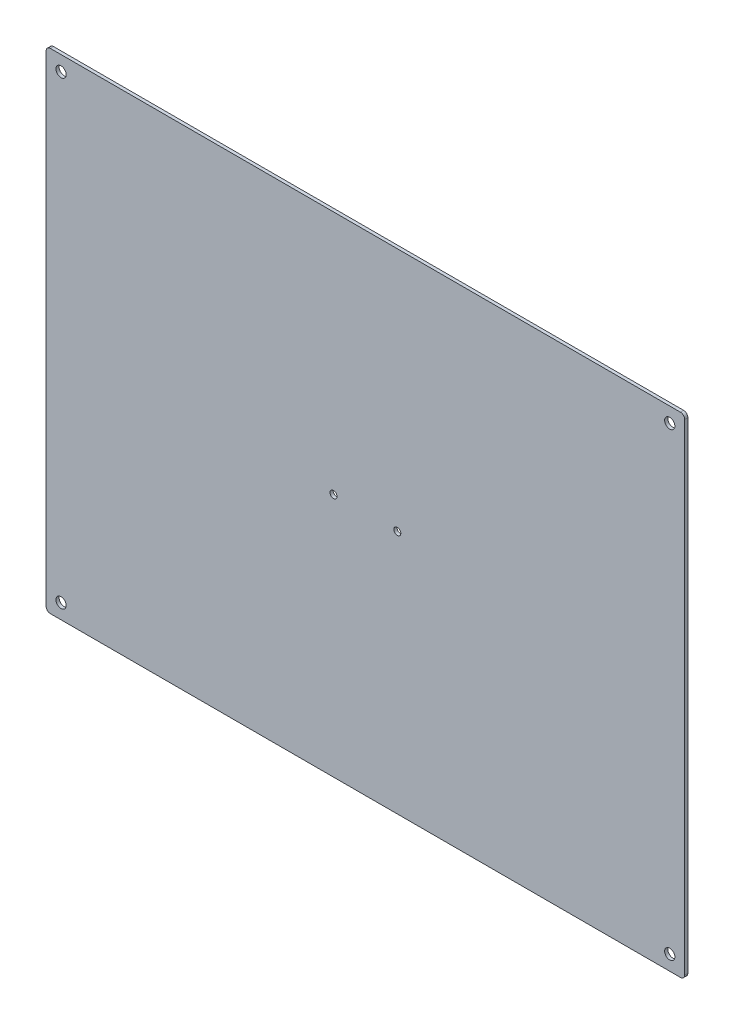
ISO-10303-21;
HEADER;
FILE_DESCRIPTION(('STEP AP214'),'2;1');
FILE_NAME('part.step','',(''),(''),'','','');
FILE_SCHEMA(('AUTOMOTIVE_DESIGN { 1 0 10303 214 1 1 1 1 }'));
ENDSEC;
DATA;
#1=APPLICATION_CONTEXT('core data for automotive mechanical design processes');
#2=APPLICATION_PROTOCOL_DEFINITION('international standard','automotive_design',2000,#1);
#3=PRODUCT_CONTEXT('',#1,'mechanical');
#4=PRODUCT('Part','Part','',(#3));
#5=PRODUCT_RELATED_PRODUCT_CATEGORY('part','',(#4));
#6=PRODUCT_DEFINITION_FORMATION('','',#4);
#7=PRODUCT_DEFINITION_CONTEXT('part definition',#1,'design');
#8=PRODUCT_DEFINITION('design','',#6,#7);
#9=PRODUCT_DEFINITION_SHAPE('','',#8);
#10=(LENGTH_UNIT() NAMED_UNIT(*) SI_UNIT(.MILLI.,.METRE.));
#11=(NAMED_UNIT(*) PLANE_ANGLE_UNIT() SI_UNIT($,.RADIAN.));
#12=(NAMED_UNIT(*) SI_UNIT($,.STERADIAN.) SOLID_ANGLE_UNIT());
#13=UNCERTAINTY_MEASURE_WITH_UNIT(LENGTH_MEASURE(1.E-05),#10,'distance_accuracy_value','');
#14=(GEOMETRIC_REPRESENTATION_CONTEXT(3) GLOBAL_UNCERTAINTY_ASSIGNED_CONTEXT((#13)) GLOBAL_UNIT_ASSIGNED_CONTEXT((#10,
#11,#12)) REPRESENTATION_CONTEXT('',''));
#15=CARTESIAN_POINT('',(0.,0.,0.));
#16=DIRECTION('',(0.,0.,1.));
#17=DIRECTION('',(1.,0.,0.));
#18=AXIS2_PLACEMENT_3D('',#15,#16,#17);
#19=CARTESIAN_POINT('',(0.,0.,0.));
#20=DIRECTION('',(0.,0.,-1.));
#21=DIRECTION('',(-1.,0.,0.));
#22=AXIS2_PLACEMENT_3D('',#19,#20,#21);
#23=PLANE('',#22);
#24=CARTESIAN_POINT('',(-15.,0.,0.));
#25=DIRECTION('',(0.,0.,1.));
#26=DIRECTION('',(1.,0.,0.));
#27=AXIS2_PLACEMENT_3D('',#24,#25,#26);
#28=CIRCLE('',#27,1.64999999999999);
#29=CARTESIAN_POINT('',(-13.35,0.,0.));
#30=VERTEX_POINT('',#29);
#31=EDGE_CURVE('E217',#30,#30,#28,.T.);
#32=ORIENTED_EDGE('',*,*,#31,.F.);
#33=EDGE_LOOP('',(#32));
#34=FACE_BOUND('',#33,.T.);
#35=CARTESIAN_POINT('',(15.,0.,0.));
#36=DIRECTION('',(0.,0.,1.));
#37=DIRECTION('',(1.,0.,0.));
#38=AXIS2_PLACEMENT_3D('',#35,#36,#37);
#39=CIRCLE('',#38,1.64999999999999);
#40=CARTESIAN_POINT('',(16.65,0.,0.));
#41=VERTEX_POINT('',#40);
#42=EDGE_CURVE('E211',#41,#41,#39,.T.);
#43=ORIENTED_EDGE('',*,*,#42,.F.);
#44=EDGE_LOOP('',(#43));
#45=FACE_BOUND('',#44,.T.);
#46=CARTESIAN_POINT('',(-143.,108.,0.));
#47=DIRECTION('',(0.,0.,1.));
#48=DIRECTION('',(1.,0.,0.));
#49=AXIS2_PLACEMENT_3D('',#46,#47,#48);
#50=CIRCLE('',#49,2.40000000000001);
#51=CARTESIAN_POINT('',(-140.6,108.,0.));
#52=VERTEX_POINT('',#51);
#53=EDGE_CURVE('E205',#52,#52,#50,.T.);
#54=ORIENTED_EDGE('',*,*,#53,.F.);
#55=EDGE_LOOP('',(#54));
#56=FACE_BOUND('',#55,.T.);
#57=CARTESIAN_POINT('',(143.,-108.,0.));
#58=DIRECTION('',(0.,0.,1.));
#59=DIRECTION('',(1.,0.,0.));
#60=AXIS2_PLACEMENT_3D('',#57,#58,#59);
#61=CIRCLE('',#60,2.40000000000001);
#62=CARTESIAN_POINT('',(145.4,-108.,0.));
#63=VERTEX_POINT('',#62);
#64=EDGE_CURVE('E193',#63,#63,#61,.T.);
#65=ORIENTED_EDGE('',*,*,#64,.F.);
#66=EDGE_LOOP('',(#65));
#67=FACE_BOUND('',#66,.T.);
#68=DIRECTION('',(1.,0.,0.));
#69=VECTOR('',#68,1.);
#70=CARTESIAN_POINT('',(-150.,-115.,0.));
#71=LINE('',#70,#69);
#72=CARTESIAN_POINT('',(-148.,-115.,0.));
#73=VERTEX_POINT('',#72);
#74=CARTESIAN_POINT('',(148.,-115.,0.));
#75=VERTEX_POINT('',#74);
#76=EDGE_CURVE('E108',#73,#75,#71,.T.);
#77=ORIENTED_EDGE('',*,*,#76,.T.);
#78=CARTESIAN_POINT('',(148.,-113.,0.));
#79=DIRECTION('',(0.,0.,-1.));
#80=DIRECTION('',(-1.,0.,0.));
#81=AXIS2_PLACEMENT_3D('',#78,#79,#80);
#82=CIRCLE('',#81,2.);
#83=CARTESIAN_POINT('',(150.,-113.,0.));
#84=VERTEX_POINT('',#83);
#85=EDGE_CURVE('E115',#75,#84,#82,.F.);
#86=ORIENTED_EDGE('',*,*,#85,.T.);
#87=DIRECTION('',(0.,1.,0.));
#88=VECTOR('',#87,1.);
#89=CARTESIAN_POINT('',(150.,-115.,0.));
#90=LINE('',#89,#88);
#91=CARTESIAN_POINT('',(150.,113.,0.));
#92=VERTEX_POINT('',#91);
#93=EDGE_CURVE('E165',#84,#92,#90,.T.);
#94=ORIENTED_EDGE('',*,*,#93,.T.);
#95=CARTESIAN_POINT('',(148.,113.,0.));
#96=DIRECTION('',(0.,0.,-1.));
#97=DIRECTION('',(-1.,0.,0.));
#98=AXIS2_PLACEMENT_3D('',#95,#96,#97);
#99=CIRCLE('',#98,2.);
#100=CARTESIAN_POINT('',(148.,115.,0.));
#101=VERTEX_POINT('',#100);
#102=EDGE_CURVE('E133',#92,#101,#99,.F.);
#103=ORIENTED_EDGE('',*,*,#102,.T.);
#104=DIRECTION('',(-1.,0.,0.));
#105=VECTOR('',#104,1.);
#106=CARTESIAN_POINT('',(-150.,115.,0.));
#107=LINE('',#106,#105);
#108=CARTESIAN_POINT('',(-148.,115.,0.));
#109=VERTEX_POINT('',#108);
#110=EDGE_CURVE('E168',#101,#109,#107,.T.);
#111=ORIENTED_EDGE('',*,*,#110,.T.);
#112=CARTESIAN_POINT('',(-148.,113.,0.));
#113=DIRECTION('',(0.,0.,-1.));
#114=DIRECTION('',(-1.,0.,0.));
#115=AXIS2_PLACEMENT_3D('',#112,#113,#114);
#116=CIRCLE('',#115,2.);
#117=CARTESIAN_POINT('',(-150.,113.,0.));
#118=VERTEX_POINT('',#117);
#119=EDGE_CURVE('E116',#109,#118,#116,.F.);
#120=ORIENTED_EDGE('',*,*,#119,.T.);
#121=DIRECTION('',(0.,-1.,0.));
#122=VECTOR('',#121,1.);
#123=CARTESIAN_POINT('',(-150.,-115.,0.));
#124=LINE('',#123,#122);
#125=CARTESIAN_POINT('',(-150.,-113.,0.));
#126=VERTEX_POINT('',#125);
#127=EDGE_CURVE('E110',#118,#126,#124,.T.);
#128=ORIENTED_EDGE('',*,*,#127,.T.);
#129=CARTESIAN_POINT('',(-148.,-113.,0.));
#130=DIRECTION('',(0.,0.,-1.));
#131=DIRECTION('',(-1.,0.,0.));
#132=AXIS2_PLACEMENT_3D('',#129,#130,#131);
#133=CIRCLE('',#132,2.);
#134=EDGE_CURVE('E105',#126,#73,#133,.F.);
#135=ORIENTED_EDGE('',*,*,#134,.T.);
#136=EDGE_LOOP('',(#77,#86,#94,#103,#111,#120,#128,#135));
#137=FACE_BOUND('',#136,.T.);
#138=CARTESIAN_POINT('',(-143.,-108.,0.));
#139=DIRECTION('',(0.,0.,1.));
#140=DIRECTION('',(1.,0.,0.));
#141=AXIS2_PLACEMENT_3D('',#138,#139,#140);
#142=CIRCLE('',#141,2.40000000000001);
#143=CARTESIAN_POINT('',(-140.6,-108.,0.));
#144=VERTEX_POINT('',#143);
#145=EDGE_CURVE('E187',#144,#144,#142,.T.);
#146=ORIENTED_EDGE('',*,*,#145,.F.);
#147=EDGE_LOOP('',(#146));
#148=FACE_BOUND('',#147,.T.);
#149=CARTESIAN_POINT('',(143.,108.,0.));
#150=DIRECTION('',(0.,0.,1.));
#151=DIRECTION('',(1.,0.,0.));
#152=AXIS2_PLACEMENT_3D('',#149,#150,#151);
#153=CIRCLE('',#152,2.40000000000001);
#154=CARTESIAN_POINT('',(145.4,108.,0.));
#155=VERTEX_POINT('',#154);
#156=EDGE_CURVE('E199',#155,#155,#153,.T.);
#157=ORIENTED_EDGE('',*,*,#156,.F.);
#158=EDGE_LOOP('',(#157));
#159=FACE_BOUND('',#158,.T.);
#160=ADVANCED_FACE('F39',(#34,#45,#56,#67,#137,#148,#159),#23,.F.);
#161=CARTESIAN_POINT('',(150.,-115.,-1.5));
#162=DIRECTION('',(1.,0.,0.));
#163=DIRECTION('',(0.,0.,-1.));
#164=AXIS2_PLACEMENT_3D('',#161,#162,#163);
#165=PLANE('',#164);
#166=ORIENTED_EDGE('',*,*,#93,.F.);
#167=DIRECTION('',(0.,0.,1.));
#168=VECTOR('',#167,1.);
#169=CARTESIAN_POINT('',(150.,-113.,-1.5));
#170=LINE('',#169,#168);
#171=CARTESIAN_POINT('',(150.,-113.,-1.5));
#172=VERTEX_POINT('',#171);
#173=EDGE_CURVE('E145',#84,#172,#170,.F.);
#174=ORIENTED_EDGE('',*,*,#173,.T.);
#175=DIRECTION('',(0.,1.,0.));
#176=VECTOR('',#175,1.);
#177=CARTESIAN_POINT('',(150.,-115.,-1.5));
#178=LINE('',#177,#176);
#179=CARTESIAN_POINT('',(150.,113.,-1.5));
#180=VERTEX_POINT('',#179);
#181=EDGE_CURVE('E126',#172,#180,#178,.T.);
#182=ORIENTED_EDGE('',*,*,#181,.T.);
#183=DIRECTION('',(0.,0.,1.));
#184=VECTOR('',#183,1.);
#185=CARTESIAN_POINT('',(150.,113.,-1.5));
#186=LINE('',#185,#184);
#187=EDGE_CURVE('E142',#180,#92,#186,.T.);
#188=ORIENTED_EDGE('',*,*,#187,.T.);
#189=EDGE_LOOP('',(#166,#174,#182,#188));
#190=FACE_BOUND('',#189,.T.);
#191=ADVANCED_FACE('F182',(#190),#165,.T.);
#192=CARTESIAN_POINT('',(-150.,-115.,-1.5));
#193=DIRECTION('',(0.,-1.,0.));
#194=DIRECTION('',(0.,0.,-1.));
#195=AXIS2_PLACEMENT_3D('',#192,#193,#194);
#196=PLANE('',#195);
#197=DIRECTION('',(1.,0.,0.));
#198=VECTOR('',#197,1.);
#199=CARTESIAN_POINT('',(-150.,-115.,-1.5));
#200=LINE('',#199,#198);
#201=CARTESIAN_POINT('',(-148.,-115.,-1.5));
#202=VERTEX_POINT('',#201);
#203=CARTESIAN_POINT('',(148.,-115.,-1.5));
#204=VERTEX_POINT('',#203);
#205=EDGE_CURVE('E131',#202,#204,#200,.T.);
#206=ORIENTED_EDGE('',*,*,#205,.T.);
#207=DIRECTION('',(0.,0.,1.));
#208=VECTOR('',#207,1.);
#209=CARTESIAN_POINT('',(148.,-115.,-1.5));
#210=LINE('',#209,#208);
#211=EDGE_CURVE('E125',#204,#75,#210,.T.);
#212=ORIENTED_EDGE('',*,*,#211,.T.);
#213=ORIENTED_EDGE('',*,*,#76,.F.);
#214=DIRECTION('',(0.,0.,1.));
#215=VECTOR('',#214,1.);
#216=CARTESIAN_POINT('',(-148.,-115.,-1.5));
#217=LINE('',#216,#215);
#218=EDGE_CURVE('E122',#73,#202,#217,.F.);
#219=ORIENTED_EDGE('',*,*,#218,.T.);
#220=EDGE_LOOP('',(#206,#212,#213,#219));
#221=FACE_BOUND('',#220,.T.);
#222=ADVANCED_FACE('F121',(#221),#196,.T.);
#223=CARTESIAN_POINT('',(-150.,-115.,-1.5));
#224=DIRECTION('',(-1.,0.,0.));
#225=DIRECTION('',(0.,0.,1.));
#226=AXIS2_PLACEMENT_3D('',#223,#224,#225);
#227=PLANE('',#226);
#228=DIRECTION('',(0.,-1.,0.));
#229=VECTOR('',#228,1.);
#230=CARTESIAN_POINT('',(-150.,-115.,-1.5));
#231=LINE('',#230,#229);
#232=CARTESIAN_POINT('',(-150.,113.,-1.5));
#233=VERTEX_POINT('',#232);
#234=CARTESIAN_POINT('',(-150.,-113.,-1.5));
#235=VERTEX_POINT('',#234);
#236=EDGE_CURVE('E135',#233,#235,#231,.T.);
#237=ORIENTED_EDGE('',*,*,#236,.T.);
#238=DIRECTION('',(0.,0.,1.));
#239=VECTOR('',#238,1.);
#240=CARTESIAN_POINT('',(-150.,-113.,-1.5));
#241=LINE('',#240,#239);
#242=EDGE_CURVE('E155',#235,#126,#241,.T.);
#243=ORIENTED_EDGE('',*,*,#242,.T.);
#244=ORIENTED_EDGE('',*,*,#127,.F.);
#245=DIRECTION('',(0.,0.,1.));
#246=VECTOR('',#245,1.);
#247=CARTESIAN_POINT('',(-150.,113.,-1.5));
#248=LINE('',#247,#246);
#249=EDGE_CURVE('E153',#118,#233,#248,.F.);
#250=ORIENTED_EDGE('',*,*,#249,.T.);
#251=EDGE_LOOP('',(#237,#243,#244,#250));
#252=FACE_BOUND('',#251,.T.);
#253=ADVANCED_FACE('F158',(#252),#227,.T.);
#254=CARTESIAN_POINT('',(-150.,115.,-1.5));
#255=DIRECTION('',(0.,1.,0.));
#256=DIRECTION('',(0.,0.,1.));
#257=AXIS2_PLACEMENT_3D('',#254,#255,#256);
#258=PLANE('',#257);
#259=DIRECTION('',(-1.,0.,0.));
#260=VECTOR('',#259,1.);
#261=CARTESIAN_POINT('',(-150.,115.,-1.5));
#262=LINE('',#261,#260);
#263=CARTESIAN_POINT('',(148.,115.,-1.5));
#264=VERTEX_POINT('',#263);
#265=CARTESIAN_POINT('',(-148.,115.,-1.5));
#266=VERTEX_POINT('',#265);
#267=EDGE_CURVE('E160',#264,#266,#262,.T.);
#268=ORIENTED_EDGE('',*,*,#267,.T.);
#269=DIRECTION('',(0.,0.,1.));
#270=VECTOR('',#269,1.);
#271=CARTESIAN_POINT('',(-148.,115.,-1.5));
#272=LINE('',#271,#270);
#273=EDGE_CURVE('E11',#266,#109,#272,.T.);
#274=ORIENTED_EDGE('',*,*,#273,.T.);
#275=ORIENTED_EDGE('',*,*,#110,.F.);
#276=DIRECTION('',(0.,0.,1.));
#277=VECTOR('',#276,1.);
#278=CARTESIAN_POINT('',(148.,115.,-1.5));
#279=LINE('',#278,#277);
#280=EDGE_CURVE('E47',#101,#264,#279,.F.);
#281=ORIENTED_EDGE('',*,*,#280,.T.);
#282=EDGE_LOOP('',(#268,#274,#275,#281));
#283=FACE_BOUND('',#282,.T.);
#284=ADVANCED_FACE('F171',(#283),#258,.T.);
#285=CARTESIAN_POINT('',(0.,0.,-1.5));
#286=DIRECTION('',(0.,0.,-1.));
#287=DIRECTION('',(-1.,0.,0.));
#288=AXIS2_PLACEMENT_3D('',#285,#286,#287);
#289=PLANE('',#288);
#290=CARTESIAN_POINT('',(-15.,0.,-1.5));
#291=DIRECTION('',(0.,0.,1.));
#292=DIRECTION('',(1.,0.,0.));
#293=AXIS2_PLACEMENT_3D('',#290,#291,#292);
#294=CIRCLE('',#293,1.65);
#295=CARTESIAN_POINT('',(-13.35,0.,-1.5));
#296=VERTEX_POINT('',#295);
#297=EDGE_CURVE('E214',#296,#296,#294,.T.);
#298=ORIENTED_EDGE('',*,*,#297,.T.);
#299=EDGE_LOOP('',(#298));
#300=FACE_BOUND('',#299,.T.);
#301=CARTESIAN_POINT('',(15.,0.,-1.5));
#302=DIRECTION('',(0.,0.,1.));
#303=DIRECTION('',(1.,0.,0.));
#304=AXIS2_PLACEMENT_3D('',#301,#302,#303);
#305=CIRCLE('',#304,1.65);
#306=CARTESIAN_POINT('',(16.65,0.,-1.5));
#307=VERTEX_POINT('',#306);
#308=EDGE_CURVE('E208',#307,#307,#305,.T.);
#309=ORIENTED_EDGE('',*,*,#308,.T.);
#310=EDGE_LOOP('',(#309));
#311=FACE_BOUND('',#310,.T.);
#312=CARTESIAN_POINT('',(-143.,108.,-1.5));
#313=DIRECTION('',(0.,0.,-1.));
#314=DIRECTION('',(-1.,0.,0.));
#315=AXIS2_PLACEMENT_3D('',#312,#313,#314);
#316=CIRCLE('',#315,2.40000000000001);
#317=CARTESIAN_POINT('',(-145.4,108.,-1.5));
#318=VERTEX_POINT('',#317);
#319=EDGE_CURVE('E202',#318,#318,#316,.T.);
#320=ORIENTED_EDGE('',*,*,#319,.F.);
#321=EDGE_LOOP('',(#320));
#322=FACE_BOUND('',#321,.T.);
#323=CARTESIAN_POINT('',(143.,108.,-1.5));
#324=DIRECTION('',(0.,0.,-1.));
#325=DIRECTION('',(-1.,0.,0.));
#326=AXIS2_PLACEMENT_3D('',#323,#324,#325);
#327=CIRCLE('',#326,2.40000000000001);
#328=CARTESIAN_POINT('',(140.6,108.,-1.5));
#329=VERTEX_POINT('',#328);
#330=EDGE_CURVE('E196',#329,#329,#327,.T.);
#331=ORIENTED_EDGE('',*,*,#330,.F.);
#332=EDGE_LOOP('',(#331));
#333=FACE_BOUND('',#332,.T.);
#334=CARTESIAN_POINT('',(143.,-108.,-1.5));
#335=DIRECTION('',(0.,0.,-1.));
#336=DIRECTION('',(-1.,0.,0.));
#337=AXIS2_PLACEMENT_3D('',#334,#335,#336);
#338=CIRCLE('',#337,2.40000000000001);
#339=CARTESIAN_POINT('',(140.6,-108.,-1.5));
#340=VERTEX_POINT('',#339);
#341=EDGE_CURVE('E190',#340,#340,#338,.T.);
#342=ORIENTED_EDGE('',*,*,#341,.F.);
#343=EDGE_LOOP('',(#342));
#344=FACE_BOUND('',#343,.T.);
#345=CARTESIAN_POINT('',(-143.,-108.,-1.5));
#346=DIRECTION('',(0.,0.,-1.));
#347=DIRECTION('',(-1.,0.,0.));
#348=AXIS2_PLACEMENT_3D('',#345,#346,#347);
#349=CIRCLE('',#348,2.40000000000001);
#350=CARTESIAN_POINT('',(-145.4,-108.,-1.5));
#351=VERTEX_POINT('',#350);
#352=EDGE_CURVE('E169',#351,#351,#349,.T.);
#353=ORIENTED_EDGE('',*,*,#352,.F.);
#354=EDGE_LOOP('',(#353));
#355=FACE_BOUND('',#354,.T.);
#356=ORIENTED_EDGE('',*,*,#181,.F.);
#357=CARTESIAN_POINT('',(148.,-113.,-1.5));
#358=DIRECTION('',(0.,0.,-1.));
#359=DIRECTION('',(-1.,0.,0.));
#360=AXIS2_PLACEMENT_3D('',#357,#358,#359);
#361=CIRCLE('',#360,2.);
#362=EDGE_CURVE('E151',#172,#204,#361,.T.);
#363=ORIENTED_EDGE('',*,*,#362,.T.);
#364=ORIENTED_EDGE('',*,*,#205,.F.);
#365=CARTESIAN_POINT('',(-148.,-113.,-1.5));
#366=DIRECTION('',(0.,0.,-1.));
#367=DIRECTION('',(-1.,0.,0.));
#368=AXIS2_PLACEMENT_3D('',#365,#366,#367);
#369=CIRCLE('',#368,2.);
#370=EDGE_CURVE('E130',#202,#235,#369,.T.);
#371=ORIENTED_EDGE('',*,*,#370,.T.);
#372=ORIENTED_EDGE('',*,*,#236,.F.);
#373=CARTESIAN_POINT('',(-148.,113.,-1.5));
#374=DIRECTION('',(0.,0.,-1.));
#375=DIRECTION('',(-1.,0.,0.));
#376=AXIS2_PLACEMENT_3D('',#373,#374,#375);
#377=CIRCLE('',#376,2.);
#378=EDGE_CURVE('E54',#233,#266,#377,.T.);
#379=ORIENTED_EDGE('',*,*,#378,.T.);
#380=ORIENTED_EDGE('',*,*,#267,.F.);
#381=CARTESIAN_POINT('',(148.,113.,-1.5));
#382=DIRECTION('',(0.,0.,-1.));
#383=DIRECTION('',(-1.,0.,0.));
#384=AXIS2_PLACEMENT_3D('',#381,#382,#383);
#385=CIRCLE('',#384,2.);
#386=EDGE_CURVE('E147',#264,#180,#385,.T.);
#387=ORIENTED_EDGE('',*,*,#386,.T.);
#388=EDGE_LOOP('',(#356,#363,#364,#371,#372,#379,#380,#387));
#389=FACE_BOUND('',#388,.T.);
#390=ADVANCED_FACE('F178',(#300,#311,#322,#333,#344,#355,#389),#289,.T.);
#391=CARTESIAN_POINT('',(-143.,-108.,0.));
#392=DIRECTION('',(0.,0.,1.));
#393=DIRECTION('',(1.,0.,0.));
#394=AXIS2_PLACEMENT_3D('',#391,#392,#393);
#395=CYLINDRICAL_SURFACE('',#394,2.40000000000001);
#396=ORIENTED_EDGE('',*,*,#145,.T.);
#397=EDGE_LOOP('',(#396));
#398=FACE_BOUND('',#397,.T.);
#399=ORIENTED_EDGE('',*,*,#352,.T.);
#400=EDGE_LOOP('',(#399));
#401=FACE_BOUND('',#400,.T.);
#402=ADVANCED_FACE('F236',(#398,#401),#395,.F.);
#403=CARTESIAN_POINT('',(143.,-108.,0.));
#404=DIRECTION('',(0.,0.,1.));
#405=DIRECTION('',(1.,0.,0.));
#406=AXIS2_PLACEMENT_3D('',#403,#404,#405);
#407=CYLINDRICAL_SURFACE('',#406,2.40000000000001);
#408=ORIENTED_EDGE('',*,*,#64,.T.);
#409=EDGE_LOOP('',(#408));
#410=FACE_BOUND('',#409,.T.);
#411=ORIENTED_EDGE('',*,*,#341,.T.);
#412=EDGE_LOOP('',(#411));
#413=FACE_BOUND('',#412,.T.);
#414=ADVANCED_FACE('F232',(#410,#413),#407,.F.);
#415=CARTESIAN_POINT('',(143.,108.,0.));
#416=DIRECTION('',(0.,0.,1.));
#417=DIRECTION('',(1.,0.,0.));
#418=AXIS2_PLACEMENT_3D('',#415,#416,#417);
#419=CYLINDRICAL_SURFACE('',#418,2.40000000000001);
#420=ORIENTED_EDGE('',*,*,#156,.T.);
#421=EDGE_LOOP('',(#420));
#422=FACE_BOUND('',#421,.T.);
#423=ORIENTED_EDGE('',*,*,#330,.T.);
#424=EDGE_LOOP('',(#423));
#425=FACE_BOUND('',#424,.T.);
#426=ADVANCED_FACE('F235',(#422,#425),#419,.F.);
#427=CARTESIAN_POINT('',(-143.,108.,0.));
#428=DIRECTION('',(0.,0.,1.));
#429=DIRECTION('',(1.,0.,0.));
#430=AXIS2_PLACEMENT_3D('',#427,#428,#429);
#431=CYLINDRICAL_SURFACE('',#430,2.40000000000001);
#432=ORIENTED_EDGE('',*,*,#53,.T.);
#433=EDGE_LOOP('',(#432));
#434=FACE_BOUND('',#433,.T.);
#435=ORIENTED_EDGE('',*,*,#319,.T.);
#436=EDGE_LOOP('',(#435));
#437=FACE_BOUND('',#436,.T.);
#438=ADVANCED_FACE('F356',(#434,#437),#431,.F.);
#439=CARTESIAN_POINT('',(15.,0.,0.));
#440=DIRECTION('',(0.,0.,1.));
#441=DIRECTION('',(1.,0.,0.));
#442=AXIS2_PLACEMENT_3D('',#439,#440,#441);
#443=CYLINDRICAL_SURFACE('',#442,1.64999999999999);
#444=ORIENTED_EDGE('',*,*,#308,.F.);
#445=EDGE_LOOP('',(#444));
#446=FACE_BOUND('',#445,.T.);
#447=ORIENTED_EDGE('',*,*,#42,.T.);
#448=EDGE_LOOP('',(#447));
#449=FACE_BOUND('',#448,.T.);
#450=ADVANCED_FACE('F345',(#446,#449),#443,.F.);
#451=CARTESIAN_POINT('',(-15.,0.,0.));
#452=DIRECTION('',(0.,0.,1.));
#453=DIRECTION('',(1.,0.,0.));
#454=AXIS2_PLACEMENT_3D('',#451,#452,#453);
#455=CYLINDRICAL_SURFACE('',#454,1.64999999999999);
#456=ORIENTED_EDGE('',*,*,#297,.F.);
#457=EDGE_LOOP('',(#456));
#458=FACE_BOUND('',#457,.T.);
#459=ORIENTED_EDGE('',*,*,#31,.T.);
#460=EDGE_LOOP('',(#459));
#461=FACE_BOUND('',#460,.T.);
#462=ADVANCED_FACE('F221',(#458,#461),#455,.F.);
#463=CARTESIAN_POINT('',(148.,-113.,-1.5));
#464=DIRECTION('',(0.,0.,1.));
#465=DIRECTION('',(1.,0.,0.));
#466=AXIS2_PLACEMENT_3D('',#463,#464,#465);
#467=CYLINDRICAL_SURFACE('',#466,2.);
#468=ORIENTED_EDGE('',*,*,#362,.F.);
#469=ORIENTED_EDGE('',*,*,#173,.F.);
#470=ORIENTED_EDGE('',*,*,#85,.F.);
#471=ORIENTED_EDGE('',*,*,#211,.F.);
#472=EDGE_LOOP('',(#468,#469,#470,#471));
#473=FACE_BOUND('',#472,.T.);
#474=ADVANCED_FACE('F261',(#473),#467,.T.);
#475=CARTESIAN_POINT('',(-148.,-113.,-1.5));
#476=DIRECTION('',(0.,0.,1.));
#477=DIRECTION('',(1.,0.,0.));
#478=AXIS2_PLACEMENT_3D('',#475,#476,#477);
#479=CYLINDRICAL_SURFACE('',#478,2.);
#480=ORIENTED_EDGE('',*,*,#370,.F.);
#481=ORIENTED_EDGE('',*,*,#218,.F.);
#482=ORIENTED_EDGE('',*,*,#134,.F.);
#483=ORIENTED_EDGE('',*,*,#242,.F.);
#484=EDGE_LOOP('',(#480,#481,#482,#483));
#485=FACE_BOUND('',#484,.T.);
#486=ADVANCED_FACE('F129',(#485),#479,.T.);
#487=CARTESIAN_POINT('',(-148.,113.,-1.5));
#488=DIRECTION('',(0.,0.,1.));
#489=DIRECTION('',(1.,0.,0.));
#490=AXIS2_PLACEMENT_3D('',#487,#488,#489);
#491=CYLINDRICAL_SURFACE('',#490,2.);
#492=ORIENTED_EDGE('',*,*,#378,.F.);
#493=ORIENTED_EDGE('',*,*,#249,.F.);
#494=ORIENTED_EDGE('',*,*,#119,.F.);
#495=ORIENTED_EDGE('',*,*,#273,.F.);
#496=EDGE_LOOP('',(#492,#493,#494,#495));
#497=FACE_BOUND('',#496,.T.);
#498=ADVANCED_FACE('F266',(#497),#491,.T.);
#499=CARTESIAN_POINT('',(148.,113.,-1.5));
#500=DIRECTION('',(0.,0.,1.));
#501=DIRECTION('',(1.,0.,0.));
#502=AXIS2_PLACEMENT_3D('',#499,#500,#501);
#503=CYLINDRICAL_SURFACE('',#502,2.);
#504=ORIENTED_EDGE('',*,*,#386,.F.);
#505=ORIENTED_EDGE('',*,*,#280,.F.);
#506=ORIENTED_EDGE('',*,*,#102,.F.);
#507=ORIENTED_EDGE('',*,*,#187,.F.);
#508=EDGE_LOOP('',(#504,#505,#506,#507));
#509=FACE_BOUND('',#508,.T.);
#510=ADVANCED_FACE('F41',(#509),#503,.T.);
#511=CLOSED_SHELL('',(#160,#191,#222,#253,#284,#390,#402,#414,#426,#438,#450,#462,#474,#486,
#498,#510));
#512=MANIFOLD_SOLID_BREP('B2',#511);
#513=ADVANCED_BREP_SHAPE_REPRESENTATION('',(#18,#512),#14);
#514=SHAPE_DEFINITION_REPRESENTATION(#9,#513);
ENDSEC;
END-ISO-10303-21;
